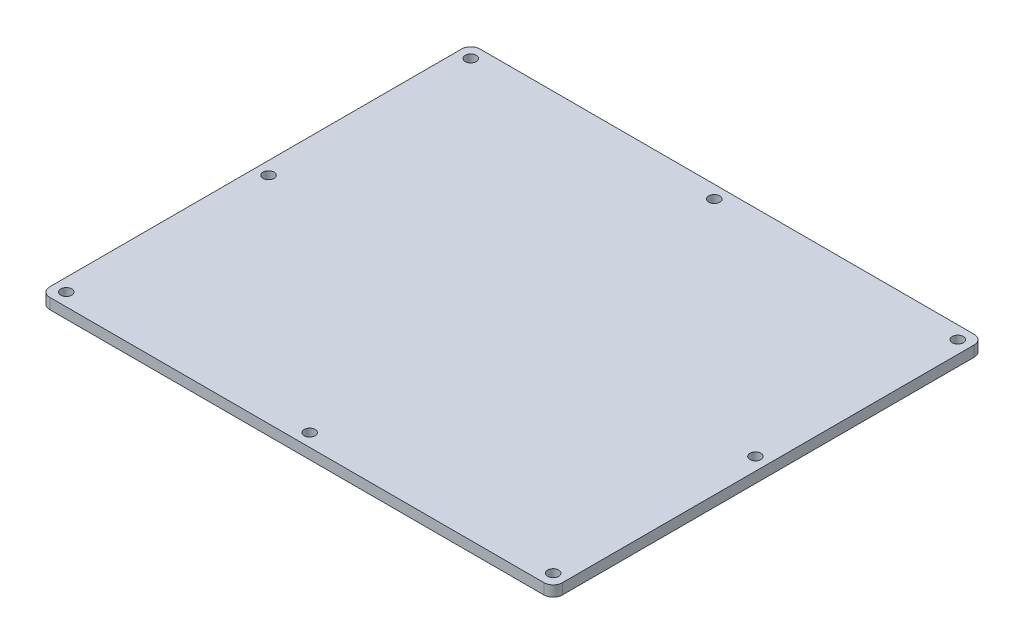
ISO-10303-21;
HEADER;
FILE_DESCRIPTION(('STEP AP214'),'2;1');
FILE_NAME('part.step','',(''),(''),'','','');
FILE_SCHEMA(('AUTOMOTIVE_DESIGN { 1 0 10303 214 1 1 1 1 }'));
ENDSEC;
DATA;
#1=APPLICATION_CONTEXT('core data for automotive mechanical design processes');
#2=APPLICATION_PROTOCOL_DEFINITION('international standard','automotive_design',2000,#1);
#3=PRODUCT_CONTEXT('',#1,'mechanical');
#4=PRODUCT('Part','Part','',(#3));
#5=PRODUCT_RELATED_PRODUCT_CATEGORY('part','',(#4));
#6=PRODUCT_DEFINITION_FORMATION('','',#4);
#7=PRODUCT_DEFINITION_CONTEXT('part definition',#1,'design');
#8=PRODUCT_DEFINITION('design','',#6,#7);
#9=PRODUCT_DEFINITION_SHAPE('','',#8);
#10=(LENGTH_UNIT() NAMED_UNIT(*) SI_UNIT(.MILLI.,.METRE.));
#11=(NAMED_UNIT(*) PLANE_ANGLE_UNIT() SI_UNIT($,.RADIAN.));
#12=(NAMED_UNIT(*) SI_UNIT($,.STERADIAN.) SOLID_ANGLE_UNIT());
#13=UNCERTAINTY_MEASURE_WITH_UNIT(LENGTH_MEASURE(1.E-05),#10,'distance_accuracy_value','');
#14=(GEOMETRIC_REPRESENTATION_CONTEXT(3) GLOBAL_UNCERTAINTY_ASSIGNED_CONTEXT((#13)) GLOBAL_UNIT_ASSIGNED_CONTEXT((#10,
#11,#12)) REPRESENTATION_CONTEXT('',''));
#15=CARTESIAN_POINT('',(0.,0.,0.));
#16=DIRECTION('',(0.,0.,1.));
#17=DIRECTION('',(1.,0.,0.));
#18=AXIS2_PLACEMENT_3D('',#15,#16,#17);
#19=CARTESIAN_POINT('',(-2.00000000000007,5.842,-223.));
#20=DIRECTION('',(0.,-1.,0.));
#21=DIRECTION('',(0.,0.,-1.));
#22=AXIS2_PLACEMENT_3D('',#19,#20,#21);
#23=PLANE('',#22);
#24=CARTESIAN_POINT('',(266.,5.842,-1.11022302462516E-13));
#25=DIRECTION('',(0.,1.,0.));
#26=DIRECTION('',(0.,0.,1.));
#27=AXIS2_PLACEMENT_3D('',#24,#25,#26);
#28=CIRCLE('',#27,2.99999999999999);
#29=CARTESIAN_POINT('',(266.,5.842,2.99999999999988));
#30=VERTEX_POINT('',#29);
#31=EDGE_CURVE('E212',#30,#30,#28,.T.);
#32=ORIENTED_EDGE('',*,*,#31,.F.);
#33=EDGE_LOOP('',(#32));
#34=FACE_BOUND('',#33,.T.);
#35=CARTESIAN_POINT('',(133.,5.842,-221.));
#36=DIRECTION('',(0.,1.,0.));
#37=DIRECTION('',(0.,0.,1.));
#38=AXIS2_PLACEMENT_3D('',#35,#36,#37);
#39=CIRCLE('',#38,2.99999999999999);
#40=CARTESIAN_POINT('',(133.,5.842,-218.));
#41=VERTEX_POINT('',#40);
#42=EDGE_CURVE('E200',#41,#41,#39,.T.);
#43=ORIENTED_EDGE('',*,*,#42,.F.);
#44=EDGE_LOOP('',(#43));
#45=FACE_BOUND('',#44,.T.);
#46=CARTESIAN_POINT('',(266.,5.842,-110.5));
#47=DIRECTION('',(0.,1.,0.));
#48=DIRECTION('',(0.,0.,1.));
#49=AXIS2_PLACEMENT_3D('',#46,#47,#48);
#50=CIRCLE('',#49,2.99999999999999);
#51=CARTESIAN_POINT('',(266.,5.842,-107.5));
#52=VERTEX_POINT('',#51);
#53=EDGE_CURVE('E188',#52,#52,#50,.T.);
#54=ORIENTED_EDGE('',*,*,#53,.F.);
#55=EDGE_LOOP('',(#54));
#56=FACE_BOUND('',#55,.T.);
#57=CARTESIAN_POINT('',(0.,5.842,-221.));
#58=DIRECTION('',(0.,1.,0.));
#59=DIRECTION('',(0.,0.,1.));
#60=AXIS2_PLACEMENT_3D('',#57,#58,#59);
#61=CIRCLE('',#60,3.);
#62=CARTESIAN_POINT('',(0.,5.842,-218.));
#63=VERTEX_POINT('',#62);
#64=EDGE_CURVE('E134',#63,#63,#61,.T.);
#65=ORIENTED_EDGE('',*,*,#64,.F.);
#66=EDGE_LOOP('',(#65));
#67=FACE_BOUND('',#66,.T.);
#68=CARTESIAN_POINT('',(-2.00000000000007,5.842,-223.));
#69=DIRECTION('',(0.,1.,0.));
#70=DIRECTION('',(0.,0.,-1.));
#71=AXIS2_PLACEMENT_3D('',#68,#69,#70);
#72=CIRCLE('',#71,5.00000000000002);
#73=CARTESIAN_POINT('',(-2.00000000000007,5.842,-228.));
#74=VERTEX_POINT('',#73);
#75=CARTESIAN_POINT('',(-7.00000000000007,5.842,-223.));
#76=VERTEX_POINT('',#75);
#77=EDGE_CURVE('E145',#74,#76,#72,.T.);
#78=ORIENTED_EDGE('',*,*,#77,.T.);
#79=DIRECTION('',(0.,0.,1.));
#80=VECTOR('',#79,1.);
#81=CARTESIAN_POINT('',(-7.00000000000007,5.842,-223.));
#82=LINE('',#81,#80);
#83=CARTESIAN_POINT('',(-6.99999999999997,5.842,2.));
#84=VERTEX_POINT('',#83);
#85=EDGE_CURVE('E93',#76,#84,#82,.T.);
#86=ORIENTED_EDGE('',*,*,#85,.T.);
#87=CARTESIAN_POINT('',(-1.99999999999997,5.842,2.));
#88=DIRECTION('',(0.,1.,0.));
#89=DIRECTION('',(0.,0.,1.));
#90=AXIS2_PLACEMENT_3D('',#87,#88,#89);
#91=CIRCLE('',#90,5.);
#92=CARTESIAN_POINT('',(-1.99999999999997,5.842,7.));
#93=VERTEX_POINT('',#92);
#94=EDGE_CURVE('E160',#84,#93,#91,.T.);
#95=ORIENTED_EDGE('',*,*,#94,.T.);
#96=DIRECTION('',(1.,0.,0.));
#97=VECTOR('',#96,1.);
#98=CARTESIAN_POINT('',(-1.99999999999997,5.842,7.));
#99=LINE('',#98,#97);
#100=CARTESIAN_POINT('',(268.,5.842,7.));
#101=VERTEX_POINT('',#100);
#102=EDGE_CURVE('E173',#93,#101,#99,.T.);
#103=ORIENTED_EDGE('',*,*,#102,.T.);
#104=CARTESIAN_POINT('',(268.,5.842,2.));
#105=DIRECTION('',(0.,1.,0.));
#106=DIRECTION('',(0.,0.,1.));
#107=AXIS2_PLACEMENT_3D('',#104,#105,#106);
#108=CIRCLE('',#107,5.);
#109=CARTESIAN_POINT('',(273.,5.842,2.));
#110=VERTEX_POINT('',#109);
#111=EDGE_CURVE('E112',#101,#110,#108,.T.);
#112=ORIENTED_EDGE('',*,*,#111,.T.);
#113=DIRECTION('',(0.,0.,-1.));
#114=VECTOR('',#113,1.);
#115=CARTESIAN_POINT('',(273.,5.842,-223.));
#116=LINE('',#115,#114);
#117=CARTESIAN_POINT('',(273.,5.842,-223.));
#118=VERTEX_POINT('',#117);
#119=EDGE_CURVE('E106',#110,#118,#116,.T.);
#120=ORIENTED_EDGE('',*,*,#119,.T.);
#121=CARTESIAN_POINT('',(268.,5.842,-223.));
#122=DIRECTION('',(0.,1.,0.));
#123=DIRECTION('',(0.,0.,-1.));
#124=AXIS2_PLACEMENT_3D('',#121,#122,#123);
#125=CIRCLE('',#124,4.99999999999998);
#126=CARTESIAN_POINT('',(268.,5.842,-228.));
#127=VERTEX_POINT('',#126);
#128=EDGE_CURVE('E110',#118,#127,#125,.T.);
#129=ORIENTED_EDGE('',*,*,#128,.T.);
#130=DIRECTION('',(-1.,0.,0.));
#131=VECTOR('',#130,1.);
#132=CARTESIAN_POINT('',(-2.00000000000007,5.842,-228.));
#133=LINE('',#132,#131);
#134=EDGE_CURVE('E50',#127,#74,#133,.T.);
#135=ORIENTED_EDGE('',*,*,#134,.T.);
#136=EDGE_LOOP('',(#78,#86,#95,#103,#112,#120,#129,#135));
#137=FACE_BOUND('',#136,.T.);
#138=CARTESIAN_POINT('',(266.,5.842,-221.));
#139=DIRECTION('',(0.,1.,0.));
#140=DIRECTION('',(0.,0.,1.));
#141=AXIS2_PLACEMENT_3D('',#138,#139,#140);
#142=CIRCLE('',#141,2.99999999999999);
#143=CARTESIAN_POINT('',(266.,5.842,-218.));
#144=VERTEX_POINT('',#143);
#145=EDGE_CURVE('E182',#144,#144,#142,.T.);
#146=ORIENTED_EDGE('',*,*,#145,.F.);
#147=EDGE_LOOP('',(#146));
#148=FACE_BOUND('',#147,.T.);
#149=CARTESIAN_POINT('',(0.,5.842,-110.5));
#150=DIRECTION('',(0.,1.,0.));
#151=DIRECTION('',(0.,0.,1.));
#152=AXIS2_PLACEMENT_3D('',#149,#150,#151);
#153=CIRCLE('',#152,3.);
#154=CARTESIAN_POINT('',(0.,5.842,-107.5));
#155=VERTEX_POINT('',#154);
#156=EDGE_CURVE('E194',#155,#155,#153,.T.);
#157=ORIENTED_EDGE('',*,*,#156,.F.);
#158=EDGE_LOOP('',(#157));
#159=FACE_BOUND('',#158,.T.);
#160=CARTESIAN_POINT('',(133.,5.842,0.));
#161=DIRECTION('',(0.,1.,0.));
#162=DIRECTION('',(0.,0.,1.));
#163=AXIS2_PLACEMENT_3D('',#160,#161,#162);
#164=CIRCLE('',#163,2.99999999999999);
#165=CARTESIAN_POINT('',(133.,5.842,2.99999999999999));
#166=VERTEX_POINT('',#165);
#167=EDGE_CURVE('E206',#166,#166,#164,.T.);
#168=ORIENTED_EDGE('',*,*,#167,.F.);
#169=EDGE_LOOP('',(#168));
#170=FACE_BOUND('',#169,.T.);
#171=CARTESIAN_POINT('',(0.,5.842,0.));
#172=DIRECTION('',(0.,1.,0.));
#173=DIRECTION('',(0.,0.,1.));
#174=AXIS2_PLACEMENT_3D('',#171,#172,#173);
#175=CIRCLE('',#174,3.);
#176=CARTESIAN_POINT('',(0.,5.842,3.));
#177=VERTEX_POINT('',#176);
#178=EDGE_CURVE('E218',#177,#177,#175,.T.);
#179=ORIENTED_EDGE('',*,*,#178,.F.);
#180=EDGE_LOOP('',(#179));
#181=FACE_BOUND('',#180,.T.);
#182=ADVANCED_FACE('F33',(#34,#45,#56,#67,#137,#148,#159,#170,#181),#23,.F.);
#183=CARTESIAN_POINT('',(-2.00000000000007,0.,-223.));
#184=DIRECTION('',(0.,-1.,0.));
#185=DIRECTION('',(0.,0.,-1.));
#186=AXIS2_PLACEMENT_3D('',#183,#184,#185);
#187=PLANE('',#186);
#188=CARTESIAN_POINT('',(266.,0.,-1.11022302462516E-13));
#189=DIRECTION('',(0.,1.,0.));
#190=DIRECTION('',(0.,0.,1.));
#191=AXIS2_PLACEMENT_3D('',#188,#189,#190);
#192=CIRCLE('',#191,2.99999999999999);
#193=CARTESIAN_POINT('',(266.,0.,2.99999999999988));
#194=VERTEX_POINT('',#193);
#195=EDGE_CURVE('E215',#194,#194,#192,.T.);
#196=ORIENTED_EDGE('',*,*,#195,.T.);
#197=EDGE_LOOP('',(#196));
#198=FACE_BOUND('',#197,.T.);
#199=CARTESIAN_POINT('',(133.,0.,-221.));
#200=DIRECTION('',(0.,1.,0.));
#201=DIRECTION('',(0.,0.,1.));
#202=AXIS2_PLACEMENT_3D('',#199,#200,#201);
#203=CIRCLE('',#202,2.99999999999999);
#204=CARTESIAN_POINT('',(133.,0.,-218.));
#205=VERTEX_POINT('',#204);
#206=EDGE_CURVE('E203',#205,#205,#203,.T.);
#207=ORIENTED_EDGE('',*,*,#206,.T.);
#208=EDGE_LOOP('',(#207));
#209=FACE_BOUND('',#208,.T.);
#210=CARTESIAN_POINT('',(266.,0.,-110.5));
#211=DIRECTION('',(0.,1.,0.));
#212=DIRECTION('',(0.,0.,1.));
#213=AXIS2_PLACEMENT_3D('',#210,#211,#212);
#214=CIRCLE('',#213,2.99999999999999);
#215=CARTESIAN_POINT('',(266.,0.,-107.5));
#216=VERTEX_POINT('',#215);
#217=EDGE_CURVE('E191',#216,#216,#214,.T.);
#218=ORIENTED_EDGE('',*,*,#217,.T.);
#219=EDGE_LOOP('',(#218));
#220=FACE_BOUND('',#219,.T.);
#221=CARTESIAN_POINT('',(0.,0.,-221.));
#222=DIRECTION('',(0.,1.,0.));
#223=DIRECTION('',(0.,0.,1.));
#224=AXIS2_PLACEMENT_3D('',#221,#222,#223);
#225=CIRCLE('',#224,3.);
#226=CARTESIAN_POINT('',(0.,0.,-218.));
#227=VERTEX_POINT('',#226);
#228=EDGE_CURVE('E179',#227,#227,#225,.T.);
#229=ORIENTED_EDGE('',*,*,#228,.T.);
#230=EDGE_LOOP('',(#229));
#231=FACE_BOUND('',#230,.T.);
#232=CARTESIAN_POINT('',(-2.00000000000007,0.,-223.));
#233=DIRECTION('',(0.,1.,0.));
#234=DIRECTION('',(0.,0.,-1.));
#235=AXIS2_PLACEMENT_3D('',#232,#233,#234);
#236=CIRCLE('',#235,5.00000000000002);
#237=CARTESIAN_POINT('',(-2.00000000000007,0.,-228.));
#238=VERTEX_POINT('',#237);
#239=CARTESIAN_POINT('',(-7.00000000000007,0.,-223.));
#240=VERTEX_POINT('',#239);
#241=EDGE_CURVE('E130',#238,#240,#236,.T.);
#242=ORIENTED_EDGE('',*,*,#241,.F.);
#243=DIRECTION('',(-1.,0.,0.));
#244=VECTOR('',#243,1.);
#245=CARTESIAN_POINT('',(-2.00000000000007,0.,-228.));
#246=LINE('',#245,#244);
#247=CARTESIAN_POINT('',(268.,0.,-228.));
#248=VERTEX_POINT('',#247);
#249=EDGE_CURVE('E85',#248,#238,#246,.T.);
#250=ORIENTED_EDGE('',*,*,#249,.F.);
#251=CARTESIAN_POINT('',(268.,0.,-223.));
#252=DIRECTION('',(0.,1.,0.));
#253=DIRECTION('',(0.,0.,-1.));
#254=AXIS2_PLACEMENT_3D('',#251,#252,#253);
#255=CIRCLE('',#254,4.99999999999998);
#256=CARTESIAN_POINT('',(273.,0.,-223.));
#257=VERTEX_POINT('',#256);
#258=EDGE_CURVE('E79',#257,#248,#255,.T.);
#259=ORIENTED_EDGE('',*,*,#258,.F.);
#260=DIRECTION('',(0.,0.,-1.));
#261=VECTOR('',#260,1.);
#262=CARTESIAN_POINT('',(273.,0.,-223.));
#263=LINE('',#262,#261);
#264=CARTESIAN_POINT('',(273.,0.,2.));
#265=VERTEX_POINT('',#264);
#266=EDGE_CURVE('E120',#265,#257,#263,.T.);
#267=ORIENTED_EDGE('',*,*,#266,.F.);
#268=CARTESIAN_POINT('',(268.,0.,2.));
#269=DIRECTION('',(0.,1.,0.));
#270=DIRECTION('',(0.,0.,1.));
#271=AXIS2_PLACEMENT_3D('',#268,#269,#270);
#272=CIRCLE('',#271,5.);
#273=CARTESIAN_POINT('',(268.,0.,7.));
#274=VERTEX_POINT('',#273);
#275=EDGE_CURVE('E140',#274,#265,#272,.T.);
#276=ORIENTED_EDGE('',*,*,#275,.F.);
#277=DIRECTION('',(1.,0.,0.));
#278=VECTOR('',#277,1.);
#279=CARTESIAN_POINT('',(-1.99999999999997,0.,7.));
#280=LINE('',#279,#278);
#281=CARTESIAN_POINT('',(-1.99999999999997,0.,7.));
#282=VERTEX_POINT('',#281);
#283=EDGE_CURVE('E138',#282,#274,#280,.T.);
#284=ORIENTED_EDGE('',*,*,#283,.F.);
#285=CARTESIAN_POINT('',(-1.99999999999997,0.,2.));
#286=DIRECTION('',(0.,1.,0.));
#287=DIRECTION('',(0.,0.,1.));
#288=AXIS2_PLACEMENT_3D('',#285,#286,#287);
#289=CIRCLE('',#288,5.);
#290=CARTESIAN_POINT('',(-6.99999999999997,0.,2.));
#291=VERTEX_POINT('',#290);
#292=EDGE_CURVE('E136',#291,#282,#289,.T.);
#293=ORIENTED_EDGE('',*,*,#292,.F.);
#294=DIRECTION('',(0.,0.,1.));
#295=VECTOR('',#294,1.);
#296=CARTESIAN_POINT('',(-7.00000000000007,0.,-223.));
#297=LINE('',#296,#295);
#298=EDGE_CURVE('E133',#240,#291,#297,.T.);
#299=ORIENTED_EDGE('',*,*,#298,.F.);
#300=EDGE_LOOP('',(#242,#250,#259,#267,#276,#284,#293,#299));
#301=FACE_BOUND('',#300,.T.);
#302=CARTESIAN_POINT('',(266.,0.,-221.));
#303=DIRECTION('',(0.,1.,0.));
#304=DIRECTION('',(0.,0.,1.));
#305=AXIS2_PLACEMENT_3D('',#302,#303,#304);
#306=CIRCLE('',#305,2.99999999999999);
#307=CARTESIAN_POINT('',(266.,0.,-218.));
#308=VERTEX_POINT('',#307);
#309=EDGE_CURVE('E185',#308,#308,#306,.T.);
#310=ORIENTED_EDGE('',*,*,#309,.T.);
#311=EDGE_LOOP('',(#310));
#312=FACE_BOUND('',#311,.T.);
#313=CARTESIAN_POINT('',(0.,0.,-110.5));
#314=DIRECTION('',(0.,1.,0.));
#315=DIRECTION('',(0.,0.,1.));
#316=AXIS2_PLACEMENT_3D('',#313,#314,#315);
#317=CIRCLE('',#316,3.);
#318=CARTESIAN_POINT('',(0.,0.,-107.5));
#319=VERTEX_POINT('',#318);
#320=EDGE_CURVE('E197',#319,#319,#317,.T.);
#321=ORIENTED_EDGE('',*,*,#320,.T.);
#322=EDGE_LOOP('',(#321));
#323=FACE_BOUND('',#322,.T.);
#324=CARTESIAN_POINT('',(133.,0.,0.));
#325=DIRECTION('',(0.,1.,0.));
#326=DIRECTION('',(0.,0.,1.));
#327=AXIS2_PLACEMENT_3D('',#324,#325,#326);
#328=CIRCLE('',#327,2.99999999999999);
#329=CARTESIAN_POINT('',(133.,0.,2.99999999999999));
#330=VERTEX_POINT('',#329);
#331=EDGE_CURVE('E209',#330,#330,#328,.T.);
#332=ORIENTED_EDGE('',*,*,#331,.T.);
#333=EDGE_LOOP('',(#332));
#334=FACE_BOUND('',#333,.T.);
#335=CARTESIAN_POINT('',(0.,0.,0.));
#336=DIRECTION('',(0.,1.,0.));
#337=DIRECTION('',(0.,0.,1.));
#338=AXIS2_PLACEMENT_3D('',#335,#336,#337);
#339=CIRCLE('',#338,3.);
#340=CARTESIAN_POINT('',(0.,0.,3.));
#341=VERTEX_POINT('',#340);
#342=EDGE_CURVE('E221',#341,#341,#339,.T.);
#343=ORIENTED_EDGE('',*,*,#342,.T.);
#344=EDGE_LOOP('',(#343));
#345=FACE_BOUND('',#344,.T.);
#346=ADVANCED_FACE('F164',(#198,#209,#220,#231,#301,#312,#323,#334,#345),#187,.T.);
#347=CARTESIAN_POINT('',(-2.00000000000007,5.842,-223.));
#348=DIRECTION('',(0.,-1.,0.));
#349=DIRECTION('',(0.,0.,-1.));
#350=AXIS2_PLACEMENT_3D('',#347,#348,#349);
#351=CYLINDRICAL_SURFACE('',#350,5.00000000000002);
#352=ORIENTED_EDGE('',*,*,#241,.T.);
#353=DIRECTION('',(0.,-1.,0.));
#354=VECTOR('',#353,1.);
#355=CARTESIAN_POINT('',(-7.00000000000007,5.842,-223.));
#356=LINE('',#355,#354);
#357=EDGE_CURVE('E11',#76,#240,#356,.T.);
#358=ORIENTED_EDGE('',*,*,#357,.F.);
#359=ORIENTED_EDGE('',*,*,#77,.F.);
#360=DIRECTION('',(0.,-1.,0.));
#361=VECTOR('',#360,1.);
#362=CARTESIAN_POINT('',(-2.00000000000007,5.842,-228.));
#363=LINE('',#362,#361);
#364=EDGE_CURVE('E126',#74,#238,#363,.T.);
#365=ORIENTED_EDGE('',*,*,#364,.T.);
#366=EDGE_LOOP('',(#352,#358,#359,#365));
#367=FACE_BOUND('',#366,.T.);
#368=ADVANCED_FACE('F35',(#367),#351,.T.);
#369=CARTESIAN_POINT('',(-7.00000000000007,5.842,-223.));
#370=DIRECTION('',(1.,0.,0.));
#371=DIRECTION('',(0.,0.,-1.));
#372=AXIS2_PLACEMENT_3D('',#369,#370,#371);
#373=PLANE('',#372);
#374=ORIENTED_EDGE('',*,*,#298,.T.);
#375=DIRECTION('',(0.,-1.,0.));
#376=VECTOR('',#375,1.);
#377=CARTESIAN_POINT('',(-6.99999999999997,5.842,2.));
#378=LINE('',#377,#376);
#379=EDGE_CURVE('E42',#84,#291,#378,.T.);
#380=ORIENTED_EDGE('',*,*,#379,.F.);
#381=ORIENTED_EDGE('',*,*,#85,.F.);
#382=ORIENTED_EDGE('',*,*,#357,.T.);
#383=EDGE_LOOP('',(#374,#380,#381,#382));
#384=FACE_BOUND('',#383,.T.);
#385=ADVANCED_FACE('F256',(#384),#373,.F.);
#386=CARTESIAN_POINT('',(-1.99999999999997,5.842,2.));
#387=DIRECTION('',(0.,-1.,0.));
#388=DIRECTION('',(0.,0.,-1.));
#389=AXIS2_PLACEMENT_3D('',#386,#387,#388);
#390=CYLINDRICAL_SURFACE('',#389,5.);
#391=ORIENTED_EDGE('',*,*,#292,.T.);
#392=DIRECTION('',(0.,-1.,0.));
#393=VECTOR('',#392,1.);
#394=CARTESIAN_POINT('',(-1.99999999999997,5.842,7.));
#395=LINE('',#394,#393);
#396=EDGE_CURVE('E152',#93,#282,#395,.T.);
#397=ORIENTED_EDGE('',*,*,#396,.F.);
#398=ORIENTED_EDGE('',*,*,#94,.F.);
#399=ORIENTED_EDGE('',*,*,#379,.T.);
#400=EDGE_LOOP('',(#391,#397,#398,#399));
#401=FACE_BOUND('',#400,.T.);
#402=ADVANCED_FACE('F158',(#401),#390,.T.);
#403=CARTESIAN_POINT('',(-1.99999999999997,5.842,7.));
#404=DIRECTION('',(0.,0.,-1.));
#405=DIRECTION('',(-1.,0.,0.));
#406=AXIS2_PLACEMENT_3D('',#403,#404,#405);
#407=PLANE('',#406);
#408=ORIENTED_EDGE('',*,*,#283,.T.);
#409=DIRECTION('',(0.,-1.,0.));
#410=VECTOR('',#409,1.);
#411=CARTESIAN_POINT('',(268.,5.842,7.));
#412=LINE('',#411,#410);
#413=EDGE_CURVE('E149',#101,#274,#412,.T.);
#414=ORIENTED_EDGE('',*,*,#413,.F.);
#415=ORIENTED_EDGE('',*,*,#102,.F.);
#416=ORIENTED_EDGE('',*,*,#396,.T.);
#417=EDGE_LOOP('',(#408,#414,#415,#416));
#418=FACE_BOUND('',#417,.T.);
#419=ADVANCED_FACE('F169',(#418),#407,.F.);
#420=CARTESIAN_POINT('',(268.,5.842,2.));
#421=DIRECTION('',(0.,-1.,0.));
#422=DIRECTION('',(0.,0.,-1.));
#423=AXIS2_PLACEMENT_3D('',#420,#421,#422);
#424=CYLINDRICAL_SURFACE('',#423,5.);
#425=ORIENTED_EDGE('',*,*,#275,.T.);
#426=DIRECTION('',(0.,-1.,0.));
#427=VECTOR('',#426,1.);
#428=CARTESIAN_POINT('',(273.,5.842,2.));
#429=LINE('',#428,#427);
#430=EDGE_CURVE('E121',#110,#265,#429,.T.);
#431=ORIENTED_EDGE('',*,*,#430,.F.);
#432=ORIENTED_EDGE('',*,*,#111,.F.);
#433=ORIENTED_EDGE('',*,*,#413,.T.);
#434=EDGE_LOOP('',(#425,#431,#432,#433));
#435=FACE_BOUND('',#434,.T.);
#436=ADVANCED_FACE('F172',(#435),#424,.T.);
#437=CARTESIAN_POINT('',(273.,5.842,-223.));
#438=DIRECTION('',(-1.,0.,0.));
#439=DIRECTION('',(0.,0.,1.));
#440=AXIS2_PLACEMENT_3D('',#437,#438,#439);
#441=PLANE('',#440);
#442=ORIENTED_EDGE('',*,*,#266,.T.);
#443=DIRECTION('',(0.,-1.,0.));
#444=VECTOR('',#443,1.);
#445=CARTESIAN_POINT('',(273.,5.842,-223.));
#446=LINE('',#445,#444);
#447=EDGE_CURVE('E117',#118,#257,#446,.T.);
#448=ORIENTED_EDGE('',*,*,#447,.F.);
#449=ORIENTED_EDGE('',*,*,#119,.F.);
#450=ORIENTED_EDGE('',*,*,#430,.T.);
#451=EDGE_LOOP('',(#442,#448,#449,#450));
#452=FACE_BOUND('',#451,.T.);
#453=ADVANCED_FACE('F118',(#452),#441,.F.);
#454=CARTESIAN_POINT('',(268.,5.842,-223.));
#455=DIRECTION('',(0.,-1.,0.));
#456=DIRECTION('',(0.,0.,-1.));
#457=AXIS2_PLACEMENT_3D('',#454,#455,#456);
#458=CYLINDRICAL_SURFACE('',#457,4.99999999999998);
#459=ORIENTED_EDGE('',*,*,#258,.T.);
#460=DIRECTION('',(0.,-1.,0.));
#461=VECTOR('',#460,1.);
#462=CARTESIAN_POINT('',(268.,5.842,-228.));
#463=LINE('',#462,#461);
#464=EDGE_CURVE('E122',#127,#248,#463,.T.);
#465=ORIENTED_EDGE('',*,*,#464,.F.);
#466=ORIENTED_EDGE('',*,*,#128,.F.);
#467=ORIENTED_EDGE('',*,*,#447,.T.);
#468=EDGE_LOOP('',(#459,#465,#466,#467));
#469=FACE_BOUND('',#468,.T.);
#470=ADVANCED_FACE('F124',(#469),#458,.T.);
#471=CARTESIAN_POINT('',(-2.00000000000007,5.842,-228.));
#472=DIRECTION('',(0.,0.,1.));
#473=DIRECTION('',(1.,0.,0.));
#474=AXIS2_PLACEMENT_3D('',#471,#472,#473);
#475=PLANE('',#474);
#476=ORIENTED_EDGE('',*,*,#249,.T.);
#477=ORIENTED_EDGE('',*,*,#364,.F.);
#478=ORIENTED_EDGE('',*,*,#134,.F.);
#479=ORIENTED_EDGE('',*,*,#464,.T.);
#480=EDGE_LOOP('',(#476,#477,#478,#479));
#481=FACE_BOUND('',#480,.T.);
#482=ADVANCED_FACE('F244',(#481),#475,.F.);
#483=CARTESIAN_POINT('',(0.,5.842,-221.));
#484=DIRECTION('',(0.,-1.,0.));
#485=DIRECTION('',(0.,0.,-1.));
#486=AXIS2_PLACEMENT_3D('',#483,#484,#485);
#487=CYLINDRICAL_SURFACE('',#486,3.);
#488=ORIENTED_EDGE('',*,*,#64,.T.);
#489=EDGE_LOOP('',(#488));
#490=FACE_BOUND('',#489,.T.);
#491=ORIENTED_EDGE('',*,*,#228,.F.);
#492=EDGE_LOOP('',(#491));
#493=FACE_BOUND('',#492,.T.);
#494=ADVANCED_FACE('F241',(#490,#493),#487,.F.);
#495=CARTESIAN_POINT('',(266.,5.842,-221.));
#496=DIRECTION('',(0.,-1.,0.));
#497=DIRECTION('',(0.,0.,-1.));
#498=AXIS2_PLACEMENT_3D('',#495,#496,#497);
#499=CYLINDRICAL_SURFACE('',#498,2.99999999999999);
#500=ORIENTED_EDGE('',*,*,#145,.T.);
#501=EDGE_LOOP('',(#500));
#502=FACE_BOUND('',#501,.T.);
#503=ORIENTED_EDGE('',*,*,#309,.F.);
#504=EDGE_LOOP('',(#503));
#505=FACE_BOUND('',#504,.T.);
#506=ADVANCED_FACE('F320',(#502,#505),#499,.F.);
#507=CARTESIAN_POINT('',(266.,5.842,-110.5));
#508=DIRECTION('',(0.,-1.,0.));
#509=DIRECTION('',(0.,0.,-1.));
#510=AXIS2_PLACEMENT_3D('',#507,#508,#509);
#511=CYLINDRICAL_SURFACE('',#510,2.99999999999999);
#512=ORIENTED_EDGE('',*,*,#53,.T.);
#513=EDGE_LOOP('',(#512));
#514=FACE_BOUND('',#513,.T.);
#515=ORIENTED_EDGE('',*,*,#217,.F.);
#516=EDGE_LOOP('',(#515));
#517=FACE_BOUND('',#516,.T.);
#518=ADVANCED_FACE('F328',(#514,#517),#511,.F.);
#519=CARTESIAN_POINT('',(0.,5.842,-110.5));
#520=DIRECTION('',(0.,-1.,0.));
#521=DIRECTION('',(0.,0.,-1.));
#522=AXIS2_PLACEMENT_3D('',#519,#520,#521);
#523=CYLINDRICAL_SURFACE('',#522,3.);
#524=ORIENTED_EDGE('',*,*,#156,.T.);
#525=EDGE_LOOP('',(#524));
#526=FACE_BOUND('',#525,.T.);
#527=ORIENTED_EDGE('',*,*,#320,.F.);
#528=EDGE_LOOP('',(#527));
#529=FACE_BOUND('',#528,.T.);
#530=ADVANCED_FACE('F336',(#526,#529),#523,.F.);
#531=CARTESIAN_POINT('',(133.,5.842,-221.));
#532=DIRECTION('',(0.,-1.,0.));
#533=DIRECTION('',(0.,0.,-1.));
#534=AXIS2_PLACEMENT_3D('',#531,#532,#533);
#535=CYLINDRICAL_SURFACE('',#534,2.99999999999999);
#536=ORIENTED_EDGE('',*,*,#42,.T.);
#537=EDGE_LOOP('',(#536));
#538=FACE_BOUND('',#537,.T.);
#539=ORIENTED_EDGE('',*,*,#206,.F.);
#540=EDGE_LOOP('',(#539));
#541=FACE_BOUND('',#540,.T.);
#542=ADVANCED_FACE('F345',(#538,#541),#535,.F.);
#543=CARTESIAN_POINT('',(133.,5.842,0.));
#544=DIRECTION('',(0.,-1.,0.));
#545=DIRECTION('',(0.,0.,-1.));
#546=AXIS2_PLACEMENT_3D('',#543,#544,#545);
#547=CYLINDRICAL_SURFACE('',#546,2.99999999999999);
#548=ORIENTED_EDGE('',*,*,#167,.T.);
#549=EDGE_LOOP('',(#548));
#550=FACE_BOUND('',#549,.T.);
#551=ORIENTED_EDGE('',*,*,#331,.F.);
#552=EDGE_LOOP('',(#551));
#553=FACE_BOUND('',#552,.T.);
#554=ADVANCED_FACE('F354',(#550,#553),#547,.F.);
#555=CARTESIAN_POINT('',(266.,5.842,-1.11022302462516E-13));
#556=DIRECTION('',(0.,-1.,0.));
#557=DIRECTION('',(0.,0.,-1.));
#558=AXIS2_PLACEMENT_3D('',#555,#556,#557);
#559=CYLINDRICAL_SURFACE('',#558,2.99999999999999);
#560=ORIENTED_EDGE('',*,*,#31,.T.);
#561=EDGE_LOOP('',(#560));
#562=FACE_BOUND('',#561,.T.);
#563=ORIENTED_EDGE('',*,*,#195,.F.);
#564=EDGE_LOOP('',(#563));
#565=FACE_BOUND('',#564,.T.);
#566=ADVANCED_FACE('F363',(#562,#565),#559,.F.);
#567=CARTESIAN_POINT('',(0.,5.842,0.));
#568=DIRECTION('',(0.,-1.,0.));
#569=DIRECTION('',(0.,0.,-1.));
#570=AXIS2_PLACEMENT_3D('',#567,#568,#569);
#571=CYLINDRICAL_SURFACE('',#570,3.);
#572=ORIENTED_EDGE('',*,*,#178,.T.);
#573=EDGE_LOOP('',(#572));
#574=FACE_BOUND('',#573,.T.);
#575=ORIENTED_EDGE('',*,*,#342,.F.);
#576=EDGE_LOOP('',(#575));
#577=FACE_BOUND('',#576,.T.);
#578=ADVANCED_FACE('F227',(#574,#577),#571,.F.);
#579=CLOSED_SHELL('',(#182,#346,#368,#385,#402,#419,#436,#453,#470,#482,#494,#506,#518,#530,
#542,#554,#566,#578));
#580=MANIFOLD_SOLID_BREP('B2',#579);
#581=ADVANCED_BREP_SHAPE_REPRESENTATION('',(#18,#580),#14);
#582=SHAPE_DEFINITION_REPRESENTATION(#9,#581);
ENDSEC;
END-ISO-10303-21;
